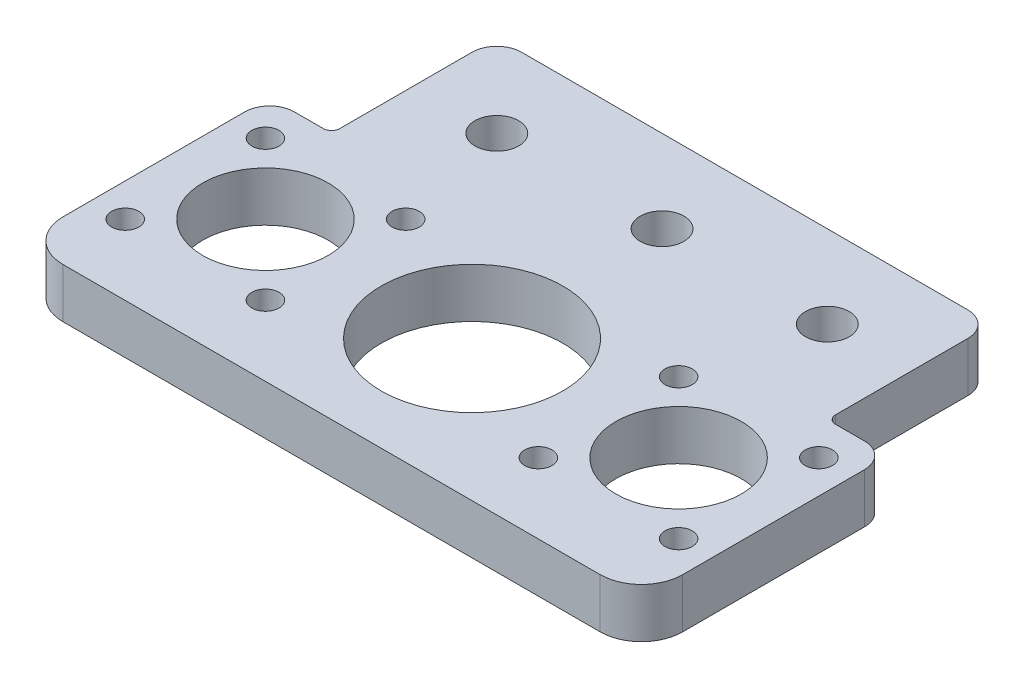
ISO-10303-21;
HEADER;
FILE_DESCRIPTION(('STEP AP214'),'2;1');
FILE_NAME('part.step','',(''),(''),'','','');
FILE_SCHEMA(('AUTOMOTIVE_DESIGN { 1 0 10303 214 1 1 1 1 }'));
ENDSEC;
DATA;
#1=APPLICATION_CONTEXT('core data for automotive mechanical design processes');
#2=APPLICATION_PROTOCOL_DEFINITION('international standard','automotive_design',2000,#1);
#3=PRODUCT_CONTEXT('',#1,'mechanical');
#4=PRODUCT('Part','Part','',(#3));
#5=PRODUCT_RELATED_PRODUCT_CATEGORY('part','',(#4));
#6=PRODUCT_DEFINITION_FORMATION('','',#4);
#7=PRODUCT_DEFINITION_CONTEXT('part definition',#1,'design');
#8=PRODUCT_DEFINITION('design','',#6,#7);
#9=PRODUCT_DEFINITION_SHAPE('','',#8);
#10=(LENGTH_UNIT() NAMED_UNIT(*) SI_UNIT(.MILLI.,.METRE.));
#11=(NAMED_UNIT(*) PLANE_ANGLE_UNIT() SI_UNIT($,.RADIAN.));
#12=(NAMED_UNIT(*) SI_UNIT($,.STERADIAN.) SOLID_ANGLE_UNIT());
#13=UNCERTAINTY_MEASURE_WITH_UNIT(LENGTH_MEASURE(1.E-05),#10,'distance_accuracy_value','');
#14=(GEOMETRIC_REPRESENTATION_CONTEXT(3) GLOBAL_UNCERTAINTY_ASSIGNED_CONTEXT((#13)) GLOBAL_UNIT_ASSIGNED_CONTEXT((#10,
#11,#12)) REPRESENTATION_CONTEXT('',''));
#15=CARTESIAN_POINT('',(0.,0.,0.));
#16=DIRECTION('',(0.,0.,1.));
#17=DIRECTION('',(1.,0.,0.));
#18=AXIS2_PLACEMENT_3D('',#15,#16,#17);
#19=CARTESIAN_POINT('',(-23.6763030341339,11.6514880135148,40.5248396396813));
#20=DIRECTION('',(0.,0.,-1.));
#21=DIRECTION('',(-1.,0.,0.));
#22=AXIS2_PLACEMENT_3D('',#19,#20,#21);
#23=PLANE('',#22);
#24=DIRECTION('',(1.,0.,0.));
#25=VECTOR('',#24,1.);
#26=CARTESIAN_POINT('',(-23.6763030341339,5.65148801351478,40.5248396396813));
#27=LINE('',#26,#25);
#28=CARTESIAN_POINT('',(-56.1763030341338,5.65148801351478,40.5248396396813));
#29=VERTEX_POINT('',#28);
#30=CARTESIAN_POINT('',(8.82369696586612,5.65148801351478,40.5248396396813));
#31=VERTEX_POINT('',#30);
#32=EDGE_CURVE('E172',#29,#31,#27,.T.);
#33=ORIENTED_EDGE('',*,*,#32,.T.);
#34=DIRECTION('',(0.,-1.,0.));
#35=VECTOR('',#34,1.);
#36=CARTESIAN_POINT('',(8.82369696586612,11.6514880135148,40.5248396396813));
#37=LINE('',#36,#35);
#38=CARTESIAN_POINT('',(8.82369696586612,11.6514880135148,40.5248396396813));
#39=VERTEX_POINT('',#38);
#40=EDGE_CURVE('E152',#39,#31,#37,.T.);
#41=ORIENTED_EDGE('',*,*,#40,.F.);
#42=DIRECTION('',(1.,0.,0.));
#43=VECTOR('',#42,1.);
#44=CARTESIAN_POINT('',(-23.6763030341339,11.6514880135148,40.5248396396813));
#45=LINE('',#44,#43);
#46=CARTESIAN_POINT('',(-56.1763030341338,11.6514880135148,40.5248396396813));
#47=VERTEX_POINT('',#46);
#48=EDGE_CURVE('E159',#47,#39,#45,.T.);
#49=ORIENTED_EDGE('',*,*,#48,.F.);
#50=DIRECTION('',(0.,-1.,0.));
#51=VECTOR('',#50,1.);
#52=CARTESIAN_POINT('',(-56.1763030341338,11.6514880135148,40.5248396396813));
#53=LINE('',#52,#51);
#54=EDGE_CURVE('E267',#47,#29,#53,.T.);
#55=ORIENTED_EDGE('',*,*,#54,.T.);
#56=EDGE_LOOP('',(#33,#41,#49,#55));
#57=FACE_BOUND('',#56,.T.);
#58=ADVANCED_FACE('F35',(#57),#23,.F.);
#59=CARTESIAN_POINT('',(8.82369696586615,11.6514880135148,35.5248396396813));
#60=DIRECTION('',(0.,-1.,0.));
#61=DIRECTION('',(0.,0.,-1.));
#62=AXIS2_PLACEMENT_3D('',#59,#60,#61);
#63=CYLINDRICAL_SURFACE('',#62,5.);
#64=CARTESIAN_POINT('',(8.82369696586615,5.65148801351478,35.5248396396813));
#65=DIRECTION('',(0.,1.,0.));
#66=DIRECTION('',(0.,0.,1.));
#67=AXIS2_PLACEMENT_3D('',#64,#65,#66);
#68=CIRCLE('',#67,5.);
#69=CARTESIAN_POINT('',(13.8236969658661,5.65148801351478,35.5248396396812));
#70=VERTEX_POINT('',#69);
#71=EDGE_CURVE('E276',#31,#70,#68,.T.);
#72=ORIENTED_EDGE('',*,*,#71,.T.);
#73=DIRECTION('',(0.,-1.,0.));
#74=VECTOR('',#73,1.);
#75=CARTESIAN_POINT('',(13.8236969658661,11.6514880135148,35.5248396396812));
#76=LINE('',#75,#74);
#77=CARTESIAN_POINT('',(13.8236969658661,11.6514880135148,35.5248396396812));
#78=VERTEX_POINT('',#77);
#79=EDGE_CURVE('E155',#78,#70,#76,.T.);
#80=ORIENTED_EDGE('',*,*,#79,.F.);
#81=CARTESIAN_POINT('',(8.82369696586615,11.6514880135148,35.5248396396813));
#82=DIRECTION('',(0.,1.,0.));
#83=DIRECTION('',(0.,0.,1.));
#84=AXIS2_PLACEMENT_3D('',#81,#82,#83);
#85=CIRCLE('',#84,5.);
#86=EDGE_CURVE('E147',#39,#78,#85,.T.);
#87=ORIENTED_EDGE('',*,*,#86,.F.);
#88=ORIENTED_EDGE('',*,*,#40,.T.);
#89=EDGE_LOOP('',(#72,#80,#87,#88));
#90=FACE_BOUND('',#89,.T.);
#91=ADVANCED_FACE('F150',(#90),#63,.T.);
#92=CARTESIAN_POINT('',(13.8236969658661,11.6514880135148,23.5248396396813));
#93=DIRECTION('',(1.,0.,0.));
#94=DIRECTION('',(0.,0.,-1.));
#95=AXIS2_PLACEMENT_3D('',#92,#93,#94);
#96=PLANE('',#95);
#97=DIRECTION('',(0.,0.,1.));
#98=VECTOR('',#97,1.);
#99=CARTESIAN_POINT('',(13.8236969658661,5.65148801351478,23.5248396396813));
#100=LINE('',#99,#98);
#101=CARTESIAN_POINT('',(13.8236969658661,5.65148801351478,13.5248396396813));
#102=VERTEX_POINT('',#101);
#103=EDGE_CURVE('E279',#102,#70,#100,.T.);
#104=ORIENTED_EDGE('',*,*,#103,.F.);
#105=DIRECTION('',(0.,-1.,0.));
#106=VECTOR('',#105,1.);
#107=CARTESIAN_POINT('',(13.8236969658661,11.6514880135148,13.5248396396813));
#108=LINE('',#107,#106);
#109=CARTESIAN_POINT('',(13.8236969658661,11.6514880135148,13.5248396396813));
#110=VERTEX_POINT('',#109);
#111=EDGE_CURVE('E215',#102,#110,#108,.F.);
#112=ORIENTED_EDGE('',*,*,#111,.T.);
#113=DIRECTION('',(0.,0.,1.));
#114=VECTOR('',#113,1.);
#115=CARTESIAN_POINT('',(13.8236969658661,11.6514880135148,23.5248396396813));
#116=LINE('',#115,#114);
#117=EDGE_CURVE('E158',#110,#78,#116,.T.);
#118=ORIENTED_EDGE('',*,*,#117,.T.);
#119=ORIENTED_EDGE('',*,*,#79,.T.);
#120=EDGE_LOOP('',(#104,#112,#118,#119));
#121=FACE_BOUND('',#120,.T.);
#122=ADVANCED_FACE('F375',(#121),#96,.T.);
#123=CARTESIAN_POINT('',(-23.6763030341339,11.6514880135148,10.5248396396813));
#124=DIRECTION('',(0.,0.,-1.));
#125=DIRECTION('',(-1.,0.,0.));
#126=AXIS2_PLACEMENT_3D('',#123,#124,#125);
#127=PLANE('',#126);
#128=DIRECTION('',(1.,0.,0.));
#129=VECTOR('',#128,1.);
#130=CARTESIAN_POINT('',(-23.6763030341339,5.65148801351478,10.5248396396813));
#131=LINE('',#130,#129);
#132=CARTESIAN_POINT('',(7.32369696586613,5.65148801351478,10.5248396396813));
#133=VERTEX_POINT('',#132);
#134=CARTESIAN_POINT('',(10.8236969658661,5.65148801351478,10.5248396396813));
#135=VERTEX_POINT('',#134);
#136=EDGE_CURVE('E287',#133,#135,#131,.T.);
#137=ORIENTED_EDGE('',*,*,#136,.F.);
#138=DIRECTION('',(0.,-1.,0.));
#139=VECTOR('',#138,1.);
#140=CARTESIAN_POINT('',(7.32369696586613,11.6514880135148,10.5248396396813));
#141=LINE('',#140,#139);
#142=CARTESIAN_POINT('',(7.32369696586613,11.6514880135148,10.5248396396813));
#143=VERTEX_POINT('',#142);
#144=EDGE_CURVE('E56',#133,#143,#141,.F.);
#145=ORIENTED_EDGE('',*,*,#144,.T.);
#146=DIRECTION('',(1.,0.,0.));
#147=VECTOR('',#146,1.);
#148=CARTESIAN_POINT('',(-23.6763030341339,11.6514880135148,10.5248396396813));
#149=LINE('',#148,#147);
#150=CARTESIAN_POINT('',(10.8236969658661,11.6514880135148,10.5248396396813));
#151=VERTEX_POINT('',#150);
#152=EDGE_CURVE('E309',#143,#151,#149,.T.);
#153=ORIENTED_EDGE('',*,*,#152,.T.);
#154=DIRECTION('',(0.,-1.,0.));
#155=VECTOR('',#154,1.);
#156=CARTESIAN_POINT('',(10.8236969658661,11.6514880135148,10.5248396396813));
#157=LINE('',#156,#155);
#158=EDGE_CURVE('E212',#151,#135,#157,.T.);
#159=ORIENTED_EDGE('',*,*,#158,.T.);
#160=EDGE_LOOP('',(#137,#145,#153,#159));
#161=FACE_BOUND('',#160,.T.);
#162=ADVANCED_FACE('F380',(#161),#127,.T.);
#163=CARTESIAN_POINT('',(6.32369696586613,11.6514880135148,23.5248396396813));
#164=DIRECTION('',(1.,0.,0.));
#165=DIRECTION('',(0.,0.,-1.));
#166=AXIS2_PLACEMENT_3D('',#163,#164,#165);
#167=PLANE('',#166);
#168=DIRECTION('',(0.,0.,1.));
#169=VECTOR('',#168,1.);
#170=CARTESIAN_POINT('',(6.32369696586613,11.6514880135148,23.5248396396813));
#171=LINE('',#170,#169);
#172=CARTESIAN_POINT('',(6.32369696586613,11.6514880135148,-6.47516036031873));
#173=VERTEX_POINT('',#172);
#174=CARTESIAN_POINT('',(6.32369696586613,11.6514880135148,9.52483963968127));
#175=VERTEX_POINT('',#174);
#176=EDGE_CURVE('E302',#173,#175,#171,.T.);
#177=ORIENTED_EDGE('',*,*,#176,.T.);
#178=DIRECTION('',(0.,-1.,0.));
#179=VECTOR('',#178,1.);
#180=CARTESIAN_POINT('',(6.32369696586613,5.65148801351478,9.52483963968127));
#181=LINE('',#180,#179);
#182=CARTESIAN_POINT('',(6.32369696586613,5.65148801351478,9.52483963968127));
#183=VERTEX_POINT('',#182);
#184=EDGE_CURVE('E222',#175,#183,#181,.T.);
#185=ORIENTED_EDGE('',*,*,#184,.T.);
#186=DIRECTION('',(0.,0.,1.));
#187=VECTOR('',#186,1.);
#188=CARTESIAN_POINT('',(6.32369696586613,5.65148801351478,23.5248396396813));
#189=LINE('',#188,#187);
#190=CARTESIAN_POINT('',(6.32369696586613,5.65148801351478,-6.47516036031873));
#191=VERTEX_POINT('',#190);
#192=EDGE_CURVE('E259',#191,#183,#189,.T.);
#193=ORIENTED_EDGE('',*,*,#192,.F.);
#194=DIRECTION('',(0.,-1.,0.));
#195=VECTOR('',#194,1.);
#196=CARTESIAN_POINT('',(6.32369696586613,11.6514880135148,-6.47516036031873));
#197=LINE('',#196,#195);
#198=EDGE_CURVE('E192',#191,#173,#197,.F.);
#199=ORIENTED_EDGE('',*,*,#198,.T.);
#200=EDGE_LOOP('',(#177,#185,#193,#199));
#201=FACE_BOUND('',#200,.T.);
#202=ADVANCED_FACE('F292',(#201),#167,.T.);
#203=CARTESIAN_POINT('',(-23.6763030341339,11.6514880135148,-9.47516036031873));
#204=DIRECTION('',(0.,0.,-1.));
#205=DIRECTION('',(-1.,0.,0.));
#206=AXIS2_PLACEMENT_3D('',#203,#204,#205);
#207=PLANE('',#206);
#208=DIRECTION('',(1.,0.,0.));
#209=VECTOR('',#208,1.);
#210=CARTESIAN_POINT('',(-23.6763030341339,11.6514880135148,-9.47516036031873));
#211=LINE('',#210,#209);
#212=CARTESIAN_POINT('',(-50.6763030341339,11.6514880135148,-9.47516036031873));
#213=VERTEX_POINT('',#212);
#214=CARTESIAN_POINT('',(3.32369696586613,11.6514880135148,-9.47516036031873));
#215=VERTEX_POINT('',#214);
#216=EDGE_CURVE('E300',#213,#215,#211,.T.);
#217=ORIENTED_EDGE('',*,*,#216,.T.);
#218=DIRECTION('',(0.,-1.,0.));
#219=VECTOR('',#218,1.);
#220=CARTESIAN_POINT('',(3.32369696586613,11.6514880135148,-9.47516036031873));
#221=LINE('',#220,#219);
#222=CARTESIAN_POINT('',(3.32369696586613,5.65148801351478,-9.47516036031873));
#223=VERTEX_POINT('',#222);
#224=EDGE_CURVE('E175',#215,#223,#221,.T.);
#225=ORIENTED_EDGE('',*,*,#224,.T.);
#226=DIRECTION('',(1.,0.,0.));
#227=VECTOR('',#226,1.);
#228=CARTESIAN_POINT('',(-23.6763030341339,5.65148801351478,-9.47516036031873));
#229=LINE('',#228,#227);
#230=CARTESIAN_POINT('',(-50.6763030341339,5.65148801351478,-9.47516036031873));
#231=VERTEX_POINT('',#230);
#232=EDGE_CURVE('E255',#231,#223,#229,.T.);
#233=ORIENTED_EDGE('',*,*,#232,.F.);
#234=DIRECTION('',(0.,-1.,0.));
#235=VECTOR('',#234,1.);
#236=CARTESIAN_POINT('',(-50.6763030341339,11.6514880135148,-9.47516036031873));
#237=LINE('',#236,#235);
#238=EDGE_CURVE('E173',#231,#213,#237,.F.);
#239=ORIENTED_EDGE('',*,*,#238,.T.);
#240=EDGE_LOOP('',(#217,#225,#233,#239));
#241=FACE_BOUND('',#240,.T.);
#242=ADVANCED_FACE('F304',(#241),#207,.T.);
#243=CARTESIAN_POINT('',(-53.6763030341339,11.6514880135148,23.5248396396813));
#244=DIRECTION('',(1.,0.,0.));
#245=DIRECTION('',(0.,0.,-1.));
#246=AXIS2_PLACEMENT_3D('',#243,#244,#245);
#247=PLANE('',#246);
#248=DIRECTION('',(0.,0.,1.));
#249=VECTOR('',#248,1.);
#250=CARTESIAN_POINT('',(-53.6763030341339,5.65148801351478,23.5248396396813));
#251=LINE('',#250,#249);
#252=CARTESIAN_POINT('',(-53.6763030341339,5.65148801351478,-6.47516036031873));
#253=VERTEX_POINT('',#252);
#254=CARTESIAN_POINT('',(-53.6763030341339,5.65148801351478,9.52483963968127));
#255=VERTEX_POINT('',#254);
#256=EDGE_CURVE('E250',#253,#255,#251,.T.);
#257=ORIENTED_EDGE('',*,*,#256,.T.);
#258=DIRECTION('',(0.,-1.,0.));
#259=VECTOR('',#258,1.);
#260=CARTESIAN_POINT('',(-53.6763030341339,11.6514880135148,9.52483963968127));
#261=LINE('',#260,#259);
#262=CARTESIAN_POINT('',(-53.6763030341339,11.6514880135148,9.52483963968127));
#263=VERTEX_POINT('',#262);
#264=EDGE_CURVE('E220',#255,#263,#261,.F.);
#265=ORIENTED_EDGE('',*,*,#264,.T.);
#266=DIRECTION('',(0.,0.,1.));
#267=VECTOR('',#266,1.);
#268=CARTESIAN_POINT('',(-53.6763030341339,11.6514880135148,23.5248396396813));
#269=LINE('',#268,#267);
#270=CARTESIAN_POINT('',(-53.6763030341339,11.6514880135148,-6.47516036031873));
#271=VERTEX_POINT('',#270);
#272=EDGE_CURVE('E234',#271,#263,#269,.T.);
#273=ORIENTED_EDGE('',*,*,#272,.F.);
#274=DIRECTION('',(0.,-1.,0.));
#275=VECTOR('',#274,1.);
#276=CARTESIAN_POINT('',(-53.6763030341339,5.65148801351478,-6.47516036031873));
#277=LINE('',#276,#275);
#278=EDGE_CURVE('E203',#271,#253,#277,.T.);
#279=ORIENTED_EDGE('',*,*,#278,.T.);
#280=EDGE_LOOP('',(#257,#265,#273,#279));
#281=FACE_BOUND('',#280,.T.);
#282=ADVANCED_FACE('F253',(#281),#247,.F.);
#283=CARTESIAN_POINT('',(-23.6763030341339,11.6514880135148,10.5248396396813));
#284=DIRECTION('',(0.,0.,1.));
#285=DIRECTION('',(1.,0.,0.));
#286=AXIS2_PLACEMENT_3D('',#283,#284,#285);
#287=PLANE('',#286);
#288=DIRECTION('',(-1.,0.,0.));
#289=VECTOR('',#288,1.);
#290=CARTESIAN_POINT('',(-23.6763030341339,11.6514880135148,10.5248396396813));
#291=LINE('',#290,#289);
#292=CARTESIAN_POINT('',(-54.6763030341339,11.6514880135148,10.5248396396813));
#293=VERTEX_POINT('',#292);
#294=CARTESIAN_POINT('',(-58.1763030341339,11.6514880135148,10.5248396396813));
#295=VERTEX_POINT('',#294);
#296=EDGE_CURVE('E232',#293,#295,#291,.T.);
#297=ORIENTED_EDGE('',*,*,#296,.F.);
#298=DIRECTION('',(0.,-1.,0.));
#299=VECTOR('',#298,1.);
#300=CARTESIAN_POINT('',(-54.6763030341339,5.65148801351478,10.5248396396813));
#301=LINE('',#300,#299);
#302=CARTESIAN_POINT('',(-54.6763030341339,5.65148801351478,10.5248396396813));
#303=VERTEX_POINT('',#302);
#304=EDGE_CURVE('E217',#293,#303,#301,.T.);
#305=ORIENTED_EDGE('',*,*,#304,.T.);
#306=DIRECTION('',(-1.,0.,0.));
#307=VECTOR('',#306,1.);
#308=CARTESIAN_POINT('',(-23.6763030341339,5.65148801351478,10.5248396396813));
#309=LINE('',#308,#307);
#310=CARTESIAN_POINT('',(-58.1763030341339,5.65148801351478,10.5248396396813));
#311=VERTEX_POINT('',#310);
#312=EDGE_CURVE('E251',#303,#311,#309,.T.);
#313=ORIENTED_EDGE('',*,*,#312,.T.);
#314=DIRECTION('',(0.,-1.,0.));
#315=VECTOR('',#314,1.);
#316=CARTESIAN_POINT('',(-58.1763030341339,11.6514880135148,10.5248396396813));
#317=LINE('',#316,#315);
#318=EDGE_CURVE('E209',#311,#295,#317,.F.);
#319=ORIENTED_EDGE('',*,*,#318,.T.);
#320=EDGE_LOOP('',(#297,#305,#313,#319));
#321=FACE_BOUND('',#320,.T.);
#322=ADVANCED_FACE('F239',(#321),#287,.F.);
#323=CARTESIAN_POINT('',(-61.1763030341339,11.6514880135148,23.5248396396813));
#324=DIRECTION('',(1.,0.,0.));
#325=DIRECTION('',(0.,0.,-1.));
#326=AXIS2_PLACEMENT_3D('',#323,#324,#325);
#327=PLANE('',#326);
#328=DIRECTION('',(0.,0.,1.));
#329=VECTOR('',#328,1.);
#330=CARTESIAN_POINT('',(-61.1763030341339,11.6514880135148,23.5248396396813));
#331=LINE('',#330,#329);
#332=CARTESIAN_POINT('',(-61.1763030341339,11.6514880135148,13.5248396396813));
#333=VERTEX_POINT('',#332);
#334=CARTESIAN_POINT('',(-61.1763030341339,11.6514880135148,35.5248396396812));
#335=VERTEX_POINT('',#334);
#336=EDGE_CURVE('E243',#333,#335,#331,.T.);
#337=ORIENTED_EDGE('',*,*,#336,.F.);
#338=DIRECTION('',(0.,-1.,0.));
#339=VECTOR('',#338,1.);
#340=CARTESIAN_POINT('',(-61.1763030341339,11.6514880135148,13.5248396396813));
#341=LINE('',#340,#339);
#342=CARTESIAN_POINT('',(-61.1763030341339,5.65148801351478,13.5248396396813));
#343=VERTEX_POINT('',#342);
#344=EDGE_CURVE('E206',#333,#343,#341,.T.);
#345=ORIENTED_EDGE('',*,*,#344,.T.);
#346=DIRECTION('',(0.,0.,1.));
#347=VECTOR('',#346,1.);
#348=CARTESIAN_POINT('',(-61.1763030341339,5.65148801351478,23.5248396396813));
#349=LINE('',#348,#347);
#350=CARTESIAN_POINT('',(-61.1763030341339,5.65148801351478,35.5248396396812));
#351=VERTEX_POINT('',#350);
#352=EDGE_CURVE('E257',#343,#351,#349,.T.);
#353=ORIENTED_EDGE('',*,*,#352,.T.);
#354=DIRECTION('',(0.,-1.,0.));
#355=VECTOR('',#354,1.);
#356=CARTESIAN_POINT('',(-61.1763030341339,11.6514880135148,35.5248396396812));
#357=LINE('',#356,#355);
#358=EDGE_CURVE('E177',#335,#351,#357,.T.);
#359=ORIENTED_EDGE('',*,*,#358,.F.);
#360=EDGE_LOOP('',(#337,#345,#353,#359));
#361=FACE_BOUND('',#360,.T.);
#362=ADVANCED_FACE('F366',(#361),#327,.F.);
#363=CARTESIAN_POINT('',(-3.67630303413388,11.6514880135148,0.524839639681272));
#364=DIRECTION('',(0.,-1.,0.));
#365=DIRECTION('',(0.,0.,-1.));
#366=AXIS2_PLACEMENT_3D('',#363,#364,#365);
#367=CYLINDRICAL_SURFACE('',#366,2.65);
#368=CARTESIAN_POINT('',(-3.67630303413388,11.6514880135148,0.524839639681272));
#369=DIRECTION('',(0.,1.,0.));
#370=DIRECTION('',(0.,0.,1.));
#371=AXIS2_PLACEMENT_3D('',#368,#369,#370);
#372=CIRCLE('',#371,2.65);
#373=CARTESIAN_POINT('',(-3.67630303413388,11.6514880135148,3.17483963968127));
#374=VERTEX_POINT('',#373);
#375=EDGE_CURVE('E169',#374,#374,#372,.T.);
#376=ORIENTED_EDGE('',*,*,#375,.T.);
#377=EDGE_LOOP('',(#376));
#378=FACE_BOUND('',#377,.T.);
#379=CARTESIAN_POINT('',(-3.67630303413388,5.65148801351478,0.524839639681272));
#380=DIRECTION('',(0.,1.,0.));
#381=DIRECTION('',(0.,0.,1.));
#382=AXIS2_PLACEMENT_3D('',#379,#380,#381);
#383=CIRCLE('',#382,2.65);
#384=CARTESIAN_POINT('',(-3.67630303413388,5.65148801351478,3.17483963968127));
#385=VERTEX_POINT('',#384);
#386=EDGE_CURVE('E277',#385,#385,#383,.T.);
#387=ORIENTED_EDGE('',*,*,#386,.F.);
#388=EDGE_LOOP('',(#387));
#389=FACE_BOUND('',#388,.T.);
#390=ADVANCED_FACE('F356',(#378,#389),#367,.F.);
#391=CARTESIAN_POINT('',(-23.6763030341339,11.6514880135148,0.524839639681272));
#392=DIRECTION('',(0.,-1.,0.));
#393=DIRECTION('',(0.,0.,-1.));
#394=AXIS2_PLACEMENT_3D('',#391,#392,#393);
#395=CYLINDRICAL_SURFACE('',#394,2.65);
#396=CARTESIAN_POINT('',(-23.6763030341339,11.6514880135148,0.524839639681272));
#397=DIRECTION('',(0.,1.,0.));
#398=DIRECTION('',(0.,0.,1.));
#399=AXIS2_PLACEMENT_3D('',#396,#397,#398);
#400=CIRCLE('',#399,2.65);
#401=CARTESIAN_POINT('',(-23.6763030341339,11.6514880135148,3.17483963968127));
#402=VERTEX_POINT('',#401);
#403=EDGE_CURVE('E451',#402,#402,#400,.T.);
#404=ORIENTED_EDGE('',*,*,#403,.T.);
#405=EDGE_LOOP('',(#404));
#406=FACE_BOUND('',#405,.T.);
#407=CARTESIAN_POINT('',(-23.6763030341339,5.65148801351478,0.524839639681272));
#408=DIRECTION('',(0.,1.,0.));
#409=DIRECTION('',(0.,0.,1.));
#410=AXIS2_PLACEMENT_3D('',#407,#408,#409);
#411=CIRCLE('',#410,2.65);
#412=CARTESIAN_POINT('',(-23.6763030341339,5.65148801351478,3.17483963968127));
#413=VERTEX_POINT('',#412);
#414=EDGE_CURVE('E282',#413,#413,#411,.T.);
#415=ORIENTED_EDGE('',*,*,#414,.F.);
#416=EDGE_LOOP('',(#415));
#417=FACE_BOUND('',#416,.T.);
#418=ADVANCED_FACE('F353',(#406,#417),#395,.F.);
#419=CARTESIAN_POINT('',(-43.6763030341339,11.6514880135148,0.524839639681272));
#420=DIRECTION('',(0.,-1.,0.));
#421=DIRECTION('',(0.,0.,-1.));
#422=AXIS2_PLACEMENT_3D('',#419,#420,#421);
#423=CYLINDRICAL_SURFACE('',#422,2.65);
#424=CARTESIAN_POINT('',(-43.6763030341339,11.6514880135148,0.524839639681272));
#425=DIRECTION('',(0.,1.,0.));
#426=DIRECTION('',(0.,0.,1.));
#427=AXIS2_PLACEMENT_3D('',#424,#425,#426);
#428=CIRCLE('',#427,2.65);
#429=CARTESIAN_POINT('',(-43.6763030341339,11.6514880135148,3.17483963968127));
#430=VERTEX_POINT('',#429);
#431=EDGE_CURVE('E448',#430,#430,#428,.T.);
#432=ORIENTED_EDGE('',*,*,#431,.T.);
#433=EDGE_LOOP('',(#432));
#434=FACE_BOUND('',#433,.T.);
#435=CARTESIAN_POINT('',(-43.6763030341339,5.65148801351478,0.524839639681272));
#436=DIRECTION('',(0.,1.,0.));
#437=DIRECTION('',(0.,0.,1.));
#438=AXIS2_PLACEMENT_3D('',#435,#436,#437);
#439=CIRCLE('',#438,2.65);
#440=CARTESIAN_POINT('',(-43.6763030341339,5.65148801351478,3.17483963968127));
#441=VERTEX_POINT('',#440);
#442=EDGE_CURVE('E346',#441,#441,#439,.T.);
#443=ORIENTED_EDGE('',*,*,#442,.F.);
#444=EDGE_LOOP('',(#443));
#445=FACE_BOUND('',#444,.T.);
#446=ADVANCED_FACE('F355',(#434,#445),#423,.F.);
#447=CARTESIAN_POINT('',(1.32369696586613,11.6514880135148,23.5248396396813));
#448=DIRECTION('',(0.,-1.,0.));
#449=DIRECTION('',(0.,0.,-1.));
#450=AXIS2_PLACEMENT_3D('',#447,#448,#449);
#451=CYLINDRICAL_SURFACE('',#450,7.6);
#452=CARTESIAN_POINT('',(1.32369696586613,11.6514880135148,23.5248396396813));
#453=DIRECTION('',(0.,1.,0.));
#454=DIRECTION('',(0.,0.,1.));
#455=AXIS2_PLACEMENT_3D('',#452,#453,#454);
#456=CIRCLE('',#455,7.6);
#457=CARTESIAN_POINT('',(1.32369696586613,11.6514880135148,31.1248396396813));
#458=VERTEX_POINT('',#457);
#459=EDGE_CURVE('E445',#458,#458,#456,.F.);
#460=ORIENTED_EDGE('',*,*,#459,.F.);
#461=EDGE_LOOP('',(#460));
#462=FACE_BOUND('',#461,.T.);
#463=CARTESIAN_POINT('',(1.32369696586613,5.65148801351478,23.5248396396813));
#464=DIRECTION('',(0.,1.,0.));
#465=DIRECTION('',(0.,0.,1.));
#466=AXIS2_PLACEMENT_3D('',#463,#464,#465);
#467=CIRCLE('',#466,7.6);
#468=CARTESIAN_POINT('',(1.32369696586613,5.65148801351478,31.1248396396813));
#469=VERTEX_POINT('',#468);
#470=EDGE_CURVE('E343',#469,#469,#467,.F.);
#471=ORIENTED_EDGE('',*,*,#470,.T.);
#472=EDGE_LOOP('',(#471));
#473=FACE_BOUND('',#472,.T.);
#474=ADVANCED_FACE('F363',(#462,#473),#451,.F.);
#475=CARTESIAN_POINT('',(-7.16158440837245,11.6514880135148,15.0395582654427));
#476=DIRECTION('',(0.,-1.,0.));
#477=DIRECTION('',(0.,0.,-1.));
#478=AXIS2_PLACEMENT_3D('',#475,#476,#477);
#479=CYLINDRICAL_SURFACE('',#478,1.65);
#480=CARTESIAN_POINT('',(-7.16158440837245,11.6514880135148,15.0395582654427));
#481=DIRECTION('',(0.,1.,0.));
#482=DIRECTION('',(0.,0.,1.));
#483=AXIS2_PLACEMENT_3D('',#480,#481,#482);
#484=CIRCLE('',#483,1.65);
#485=CARTESIAN_POINT('',(-7.16158440837245,11.6514880135148,16.6895582654427));
#486=VERTEX_POINT('',#485);
#487=EDGE_CURVE('E442',#486,#486,#484,.F.);
#488=ORIENTED_EDGE('',*,*,#487,.F.);
#489=EDGE_LOOP('',(#488));
#490=FACE_BOUND('',#489,.T.);
#491=CARTESIAN_POINT('',(-7.16158440837245,5.65148801351478,15.0395582654427));
#492=DIRECTION('',(0.,1.,0.));
#493=DIRECTION('',(0.,0.,1.));
#494=AXIS2_PLACEMENT_3D('',#491,#492,#493);
#495=CIRCLE('',#494,1.65);
#496=CARTESIAN_POINT('',(-7.16158440837245,5.65148801351478,16.6895582654427));
#497=VERTEX_POINT('',#496);
#498=EDGE_CURVE('E340',#497,#497,#495,.F.);
#499=ORIENTED_EDGE('',*,*,#498,.T.);
#500=EDGE_LOOP('',(#499));
#501=FACE_BOUND('',#500,.T.);
#502=ADVANCED_FACE('F509',(#490,#501),#479,.F.);
#503=CARTESIAN_POINT('',(-48.6763030341339,11.6514880135148,23.5248396396813));
#504=DIRECTION('',(0.,-1.,0.));
#505=DIRECTION('',(0.,0.,-1.));
#506=AXIS2_PLACEMENT_3D('',#503,#504,#505);
#507=CYLINDRICAL_SURFACE('',#506,7.6);
#508=CARTESIAN_POINT('',(-48.6763030341339,11.6514880135148,23.5248396396813));
#509=DIRECTION('',(0.,1.,0.));
#510=DIRECTION('',(0.,0.,1.));
#511=AXIS2_PLACEMENT_3D('',#508,#509,#510);
#512=CIRCLE('',#511,7.6);
#513=CARTESIAN_POINT('',(-48.6763030341339,11.6514880135148,31.1248396396813));
#514=VERTEX_POINT('',#513);
#515=EDGE_CURVE('E439',#514,#514,#512,.T.);
#516=ORIENTED_EDGE('',*,*,#515,.T.);
#517=EDGE_LOOP('',(#516));
#518=FACE_BOUND('',#517,.T.);
#519=CARTESIAN_POINT('',(-48.6763030341339,5.65148801351478,23.5248396396813));
#520=DIRECTION('',(0.,1.,0.));
#521=DIRECTION('',(0.,0.,1.));
#522=AXIS2_PLACEMENT_3D('',#519,#520,#521);
#523=CIRCLE('',#522,7.6);
#524=CARTESIAN_POINT('',(-48.6763030341339,5.65148801351478,31.1248396396813));
#525=VERTEX_POINT('',#524);
#526=EDGE_CURVE('E337',#525,#525,#523,.T.);
#527=ORIENTED_EDGE('',*,*,#526,.F.);
#528=EDGE_LOOP('',(#527));
#529=FACE_BOUND('',#528,.T.);
#530=ADVANCED_FACE('F505',(#518,#529),#507,.F.);
#531=CARTESIAN_POINT('',(-57.1615844083724,11.6514880135148,15.0395582654427));
#532=DIRECTION('',(0.,-1.,0.));
#533=DIRECTION('',(0.,0.,-1.));
#534=AXIS2_PLACEMENT_3D('',#531,#532,#533);
#535=CYLINDRICAL_SURFACE('',#534,1.65);
#536=CARTESIAN_POINT('',(-57.1615844083724,11.6514880135148,15.0395582654427));
#537=DIRECTION('',(0.,1.,0.));
#538=DIRECTION('',(0.,0.,1.));
#539=AXIS2_PLACEMENT_3D('',#536,#537,#538);
#540=CIRCLE('',#539,1.65);
#541=CARTESIAN_POINT('',(-57.1615844083724,11.6514880135148,16.6895582654427));
#542=VERTEX_POINT('',#541);
#543=EDGE_CURVE('E436',#542,#542,#540,.T.);
#544=ORIENTED_EDGE('',*,*,#543,.T.);
#545=EDGE_LOOP('',(#544));
#546=FACE_BOUND('',#545,.T.);
#547=CARTESIAN_POINT('',(-57.1615844083724,5.65148801351478,15.0395582654427));
#548=DIRECTION('',(0.,1.,0.));
#549=DIRECTION('',(0.,0.,1.));
#550=AXIS2_PLACEMENT_3D('',#547,#548,#549);
#551=CIRCLE('',#550,1.65);
#552=CARTESIAN_POINT('',(-57.1615844083724,5.65148801351478,16.6895582654427));
#553=VERTEX_POINT('',#552);
#554=EDGE_CURVE('E334',#553,#553,#551,.T.);
#555=ORIENTED_EDGE('',*,*,#554,.F.);
#556=EDGE_LOOP('',(#555));
#557=FACE_BOUND('',#556,.T.);
#558=ADVANCED_FACE('F501',(#546,#557),#535,.F.);
#559=CARTESIAN_POINT('',(-40.1910216598953,11.6514880135148,15.0395582654427));
#560=DIRECTION('',(0.,-1.,0.));
#561=DIRECTION('',(0.,0.,-1.));
#562=AXIS2_PLACEMENT_3D('',#559,#560,#561);
#563=CYLINDRICAL_SURFACE('',#562,1.65);
#564=CARTESIAN_POINT('',(-40.1910216598953,11.6514880135148,15.0395582654427));
#565=DIRECTION('',(0.,1.,0.));
#566=DIRECTION('',(0.,0.,1.));
#567=AXIS2_PLACEMENT_3D('',#564,#565,#566);
#568=CIRCLE('',#567,1.65);
#569=CARTESIAN_POINT('',(-40.1910216598953,11.6514880135148,16.6895582654427));
#570=VERTEX_POINT('',#569);
#571=EDGE_CURVE('E433',#570,#570,#568,.T.);
#572=ORIENTED_EDGE('',*,*,#571,.T.);
#573=EDGE_LOOP('',(#572));
#574=FACE_BOUND('',#573,.T.);
#575=CARTESIAN_POINT('',(-40.1910216598953,5.65148801351478,15.0395582654427));
#576=DIRECTION('',(0.,1.,0.));
#577=DIRECTION('',(0.,0.,1.));
#578=AXIS2_PLACEMENT_3D('',#575,#576,#577);
#579=CIRCLE('',#578,1.65);
#580=CARTESIAN_POINT('',(-40.1910216598953,5.65148801351478,16.6895582654427));
#581=VERTEX_POINT('',#580);
#582=EDGE_CURVE('E331',#581,#581,#579,.T.);
#583=ORIENTED_EDGE('',*,*,#582,.F.);
#584=EDGE_LOOP('',(#583));
#585=FACE_BOUND('',#584,.T.);
#586=ADVANCED_FACE('F497',(#574,#585),#563,.F.);
#587=CARTESIAN_POINT('',(-40.1910216598953,11.6514880135148,32.0101210139198));
#588=DIRECTION('',(0.,-1.,0.));
#589=DIRECTION('',(0.,0.,-1.));
#590=AXIS2_PLACEMENT_3D('',#587,#588,#589);
#591=CYLINDRICAL_SURFACE('',#590,1.65000000000001);
#592=CARTESIAN_POINT('',(-40.1910216598953,11.6514880135148,32.0101210139198));
#593=DIRECTION('',(0.,1.,0.));
#594=DIRECTION('',(0.,0.,1.));
#595=AXIS2_PLACEMENT_3D('',#592,#593,#594);
#596=CIRCLE('',#595,1.65000000000001);
#597=CARTESIAN_POINT('',(-40.1910216598953,11.6514880135148,33.6601210139198));
#598=VERTEX_POINT('',#597);
#599=EDGE_CURVE('E430',#598,#598,#596,.T.);
#600=ORIENTED_EDGE('',*,*,#599,.T.);
#601=EDGE_LOOP('',(#600));
#602=FACE_BOUND('',#601,.T.);
#603=CARTESIAN_POINT('',(-40.1910216598953,5.65148801351478,32.0101210139198));
#604=DIRECTION('',(0.,1.,0.));
#605=DIRECTION('',(0.,0.,1.));
#606=AXIS2_PLACEMENT_3D('',#603,#604,#605);
#607=CIRCLE('',#606,1.65000000000001);
#608=CARTESIAN_POINT('',(-40.1910216598953,5.65148801351478,33.6601210139198));
#609=VERTEX_POINT('',#608);
#610=EDGE_CURVE('E328',#609,#609,#607,.T.);
#611=ORIENTED_EDGE('',*,*,#610,.F.);
#612=EDGE_LOOP('',(#611));
#613=FACE_BOUND('',#612,.T.);
#614=ADVANCED_FACE('F493',(#602,#613),#591,.F.);
#615=CARTESIAN_POINT('',(-57.1615844083724,11.6514880135148,32.0101210139198));
#616=DIRECTION('',(0.,-1.,0.));
#617=DIRECTION('',(0.,0.,-1.));
#618=AXIS2_PLACEMENT_3D('',#615,#616,#617);
#619=CYLINDRICAL_SURFACE('',#618,1.65);
#620=CARTESIAN_POINT('',(-57.1615844083724,11.6514880135148,32.0101210139198));
#621=DIRECTION('',(0.,1.,0.));
#622=DIRECTION('',(0.,0.,1.));
#623=AXIS2_PLACEMENT_3D('',#620,#621,#622);
#624=CIRCLE('',#623,1.65);
#625=CARTESIAN_POINT('',(-57.1615844083724,11.6514880135148,33.6601210139198));
#626=VERTEX_POINT('',#625);
#627=EDGE_CURVE('E427',#626,#626,#624,.T.);
#628=ORIENTED_EDGE('',*,*,#627,.T.);
#629=EDGE_LOOP('',(#628));
#630=FACE_BOUND('',#629,.T.);
#631=CARTESIAN_POINT('',(-57.1615844083724,5.65148801351478,32.0101210139198));
#632=DIRECTION('',(0.,1.,0.));
#633=DIRECTION('',(0.,0.,1.));
#634=AXIS2_PLACEMENT_3D('',#631,#632,#633);
#635=CIRCLE('',#634,1.65);
#636=CARTESIAN_POINT('',(-57.1615844083724,5.65148801351478,33.6601210139198));
#637=VERTEX_POINT('',#636);
#638=EDGE_CURVE('E325',#637,#637,#635,.T.);
#639=ORIENTED_EDGE('',*,*,#638,.F.);
#640=EDGE_LOOP('',(#639));
#641=FACE_BOUND('',#640,.T.);
#642=ADVANCED_FACE('F489',(#630,#641),#619,.F.);
#643=CARTESIAN_POINT('',(-7.16158440837244,11.6514880135148,32.0101210139198));
#644=DIRECTION('',(0.,-1.,0.));
#645=DIRECTION('',(0.,0.,-1.));
#646=AXIS2_PLACEMENT_3D('',#643,#644,#645);
#647=CYLINDRICAL_SURFACE('',#646,1.65000000000001);
#648=CARTESIAN_POINT('',(-7.16158440837244,11.6514880135148,32.0101210139198));
#649=DIRECTION('',(0.,1.,0.));
#650=DIRECTION('',(0.,0.,1.));
#651=AXIS2_PLACEMENT_3D('',#648,#649,#650);
#652=CIRCLE('',#651,1.65000000000001);
#653=CARTESIAN_POINT('',(-7.16158440837244,11.6514880135148,33.6601210139198));
#654=VERTEX_POINT('',#653);
#655=EDGE_CURVE('E424',#654,#654,#652,.F.);
#656=ORIENTED_EDGE('',*,*,#655,.F.);
#657=EDGE_LOOP('',(#656));
#658=FACE_BOUND('',#657,.T.);
#659=CARTESIAN_POINT('',(-7.16158440837244,5.65148801351478,32.0101210139198));
#660=DIRECTION('',(0.,1.,0.));
#661=DIRECTION('',(0.,0.,1.));
#662=AXIS2_PLACEMENT_3D('',#659,#660,#661);
#663=CIRCLE('',#662,1.65000000000001);
#664=CARTESIAN_POINT('',(-7.16158440837244,5.65148801351478,33.6601210139198));
#665=VERTEX_POINT('',#664);
#666=EDGE_CURVE('E322',#665,#665,#663,.F.);
#667=ORIENTED_EDGE('',*,*,#666,.T.);
#668=EDGE_LOOP('',(#667));
#669=FACE_BOUND('',#668,.T.);
#670=ADVANCED_FACE('F485',(#658,#669),#647,.F.);
#671=CARTESIAN_POINT('',(9.8089783401047,11.6514880135148,15.0395582654427));
#672=DIRECTION('',(0.,-1.,0.));
#673=DIRECTION('',(0.,0.,-1.));
#674=AXIS2_PLACEMENT_3D('',#671,#672,#673);
#675=CYLINDRICAL_SURFACE('',#674,1.65);
#676=CARTESIAN_POINT('',(9.8089783401047,11.6514880135148,15.0395582654427));
#677=DIRECTION('',(0.,1.,0.));
#678=DIRECTION('',(0.,0.,1.));
#679=AXIS2_PLACEMENT_3D('',#676,#677,#678);
#680=CIRCLE('',#679,1.65);
#681=CARTESIAN_POINT('',(9.8089783401047,11.6514880135148,16.6895582654427));
#682=VERTEX_POINT('',#681);
#683=EDGE_CURVE('E421',#682,#682,#680,.F.);
#684=ORIENTED_EDGE('',*,*,#683,.F.);
#685=EDGE_LOOP('',(#684));
#686=FACE_BOUND('',#685,.T.);
#687=CARTESIAN_POINT('',(9.8089783401047,5.65148801351478,15.0395582654427));
#688=DIRECTION('',(0.,1.,0.));
#689=DIRECTION('',(0.,0.,1.));
#690=AXIS2_PLACEMENT_3D('',#687,#688,#689);
#691=CIRCLE('',#690,1.65);
#692=CARTESIAN_POINT('',(9.8089783401047,5.65148801351478,16.6895582654427));
#693=VERTEX_POINT('',#692);
#694=EDGE_CURVE('E318',#693,#693,#691,.F.);
#695=ORIENTED_EDGE('',*,*,#694,.T.);
#696=EDGE_LOOP('',(#695));
#697=FACE_BOUND('',#696,.T.);
#698=ADVANCED_FACE('F481',(#686,#697),#675,.F.);
#699=CARTESIAN_POINT('',(9.8089783401047,11.6514880135148,32.0101210139198));
#700=DIRECTION('',(0.,-1.,0.));
#701=DIRECTION('',(0.,0.,-1.));
#702=AXIS2_PLACEMENT_3D('',#699,#700,#701);
#703=CYLINDRICAL_SURFACE('',#702,1.65);
#704=CARTESIAN_POINT('',(9.8089783401047,11.6514880135148,32.0101210139198));
#705=DIRECTION('',(0.,1.,0.));
#706=DIRECTION('',(0.,0.,1.));
#707=AXIS2_PLACEMENT_3D('',#704,#705,#706);
#708=CIRCLE('',#707,1.65);
#709=CARTESIAN_POINT('',(9.8089783401047,11.6514880135148,33.6601210139198));
#710=VERTEX_POINT('',#709);
#711=EDGE_CURVE('E266',#710,#710,#708,.F.);
#712=ORIENTED_EDGE('',*,*,#711,.F.);
#713=EDGE_LOOP('',(#712));
#714=FACE_BOUND('',#713,.T.);
#715=CARTESIAN_POINT('',(9.8089783401047,5.65148801351478,32.0101210139198));
#716=DIRECTION('',(0.,1.,0.));
#717=DIRECTION('',(0.,0.,1.));
#718=AXIS2_PLACEMENT_3D('',#715,#716,#717);
#719=CIRCLE('',#718,1.65);
#720=CARTESIAN_POINT('',(9.8089783401047,5.65148801351478,33.6601210139198));
#721=VERTEX_POINT('',#720);
#722=EDGE_CURVE('E315',#721,#721,#719,.F.);
#723=ORIENTED_EDGE('',*,*,#722,.T.);
#724=EDGE_LOOP('',(#723));
#725=FACE_BOUND('',#724,.T.);
#726=ADVANCED_FACE('F396',(#714,#725),#703,.F.);
#727=CARTESIAN_POINT('',(-56.1763030341339,11.6514880135148,35.5248396396813));
#728=DIRECTION('',(0.,-1.,0.));
#729=DIRECTION('',(0.,0.,-1.));
#730=AXIS2_PLACEMENT_3D('',#727,#728,#729);
#731=CYLINDRICAL_SURFACE('',#730,5.);
#732=CARTESIAN_POINT('',(-56.1763030341339,5.65148801351478,35.5248396396813));
#733=DIRECTION('',(0.,1.,0.));
#734=DIRECTION('',(0.,0.,1.));
#735=AXIS2_PLACEMENT_3D('',#732,#733,#734);
#736=CIRCLE('',#735,5.);
#737=EDGE_CURVE('E264',#351,#29,#736,.T.);
#738=ORIENTED_EDGE('',*,*,#737,.T.);
#739=ORIENTED_EDGE('',*,*,#54,.F.);
#740=CARTESIAN_POINT('',(-56.1763030341339,11.6514880135148,35.5248396396813));
#741=DIRECTION('',(0.,1.,0.));
#742=DIRECTION('',(0.,0.,1.));
#743=AXIS2_PLACEMENT_3D('',#740,#741,#742);
#744=CIRCLE('',#743,5.);
#745=EDGE_CURVE('E165',#335,#47,#744,.T.);
#746=ORIENTED_EDGE('',*,*,#745,.F.);
#747=ORIENTED_EDGE('',*,*,#358,.T.);
#748=EDGE_LOOP('',(#738,#739,#746,#747));
#749=FACE_BOUND('',#748,.T.);
#750=ADVANCED_FACE('F272',(#749),#731,.T.);
#751=CARTESIAN_POINT('',(-23.6763030341339,11.6514880135148,23.5248396396813));
#752=DIRECTION('',(0.,1.,0.));
#753=DIRECTION('',(0.,0.,1.));
#754=AXIS2_PLACEMENT_3D('',#751,#752,#753);
#755=PLANE('',#754);
#756=CARTESIAN_POINT('',(-23.6763030341339,11.6514880135148,23.5248396396813));
#757=DIRECTION('',(0.,1.,0.));
#758=DIRECTION('',(0.,0.,1.));
#759=AXIS2_PLACEMENT_3D('',#756,#757,#758);
#760=CIRCLE('',#759,11.);
#761=CARTESIAN_POINT('',(-23.6763030341339,11.6514880135148,34.5248396396813));
#762=VERTEX_POINT('',#761);
#763=EDGE_CURVE('E415',#762,#762,#760,.T.);
#764=ORIENTED_EDGE('',*,*,#763,.F.);
#765=EDGE_LOOP('',(#764));
#766=FACE_BOUND('',#765,.T.);
#767=ORIENTED_EDGE('',*,*,#711,.T.);
#768=EDGE_LOOP('',(#767));
#769=FACE_BOUND('',#768,.T.);
#770=ORIENTED_EDGE('',*,*,#683,.T.);
#771=EDGE_LOOP('',(#770));
#772=FACE_BOUND('',#771,.T.);
#773=ORIENTED_EDGE('',*,*,#655,.T.);
#774=EDGE_LOOP('',(#773));
#775=FACE_BOUND('',#774,.T.);
#776=ORIENTED_EDGE('',*,*,#627,.F.);
#777=EDGE_LOOP('',(#776));
#778=FACE_BOUND('',#777,.T.);
#779=ORIENTED_EDGE('',*,*,#599,.F.);
#780=EDGE_LOOP('',(#779));
#781=FACE_BOUND('',#780,.T.);
#782=ORIENTED_EDGE('',*,*,#571,.F.);
#783=EDGE_LOOP('',(#782));
#784=FACE_BOUND('',#783,.T.);
#785=ORIENTED_EDGE('',*,*,#543,.F.);
#786=EDGE_LOOP('',(#785));
#787=FACE_BOUND('',#786,.T.);
#788=ORIENTED_EDGE('',*,*,#515,.F.);
#789=EDGE_LOOP('',(#788));
#790=FACE_BOUND('',#789,.T.);
#791=ORIENTED_EDGE('',*,*,#487,.T.);
#792=EDGE_LOOP('',(#791));
#793=FACE_BOUND('',#792,.T.);
#794=ORIENTED_EDGE('',*,*,#459,.T.);
#795=EDGE_LOOP('',(#794));
#796=FACE_BOUND('',#795,.T.);
#797=ORIENTED_EDGE('',*,*,#431,.F.);
#798=EDGE_LOOP('',(#797));
#799=FACE_BOUND('',#798,.T.);
#800=ORIENTED_EDGE('',*,*,#403,.F.);
#801=EDGE_LOOP('',(#800));
#802=FACE_BOUND('',#801,.T.);
#803=ORIENTED_EDGE('',*,*,#375,.F.);
#804=EDGE_LOOP('',(#803));
#805=FACE_BOUND('',#804,.T.);
#806=ORIENTED_EDGE('',*,*,#176,.F.);
#807=CARTESIAN_POINT('',(3.32369696586613,11.6514880135148,-6.47516036031873));
#808=DIRECTION('',(0.,1.,0.));
#809=DIRECTION('',(0.,0.,1.));
#810=AXIS2_PLACEMENT_3D('',#807,#808,#809);
#811=CIRCLE('',#810,3.);
#812=EDGE_CURVE('E201',#173,#215,#811,.T.);
#813=ORIENTED_EDGE('',*,*,#812,.T.);
#814=ORIENTED_EDGE('',*,*,#216,.F.);
#815=CARTESIAN_POINT('',(-50.6763030341339,11.6514880135148,-6.47516036031873));
#816=DIRECTION('',(0.,1.,0.));
#817=DIRECTION('',(0.,0.,1.));
#818=AXIS2_PLACEMENT_3D('',#815,#816,#817);
#819=CIRCLE('',#818,3.);
#820=EDGE_CURVE('E199',#213,#271,#819,.T.);
#821=ORIENTED_EDGE('',*,*,#820,.T.);
#822=ORIENTED_EDGE('',*,*,#272,.T.);
#823=CARTESIAN_POINT('',(-54.6763030341339,11.6514880135148,9.52483963968127));
#824=DIRECTION('',(0.,1.,0.));
#825=DIRECTION('',(0.,0.,1.));
#826=AXIS2_PLACEMENT_3D('',#823,#824,#825);
#827=CIRCLE('',#826,1.);
#828=EDGE_CURVE('E228',#263,#293,#827,.F.);
#829=ORIENTED_EDGE('',*,*,#828,.T.);
#830=ORIENTED_EDGE('',*,*,#296,.T.);
#831=CARTESIAN_POINT('',(-58.1763030341339,11.6514880135148,13.5248396396813));
#832=DIRECTION('',(0.,1.,0.));
#833=DIRECTION('',(0.,0.,1.));
#834=AXIS2_PLACEMENT_3D('',#831,#832,#833);
#835=CIRCLE('',#834,3.);
#836=EDGE_CURVE('E197',#295,#333,#835,.T.);
#837=ORIENTED_EDGE('',*,*,#836,.T.);
#838=ORIENTED_EDGE('',*,*,#336,.T.);
#839=ORIENTED_EDGE('',*,*,#745,.T.);
#840=ORIENTED_EDGE('',*,*,#48,.T.);
#841=ORIENTED_EDGE('',*,*,#86,.T.);
#842=ORIENTED_EDGE('',*,*,#117,.F.);
#843=CARTESIAN_POINT('',(10.8236969658661,11.6514880135148,13.5248396396813));
#844=DIRECTION('',(0.,1.,0.));
#845=DIRECTION('',(0.,0.,1.));
#846=AXIS2_PLACEMENT_3D('',#843,#844,#845);
#847=CIRCLE('',#846,3.);
#848=EDGE_CURVE('E194',#110,#151,#847,.T.);
#849=ORIENTED_EDGE('',*,*,#848,.T.);
#850=ORIENTED_EDGE('',*,*,#152,.F.);
#851=CARTESIAN_POINT('',(7.32369696586613,11.6514880135148,9.52483963968127));
#852=DIRECTION('',(0.,1.,0.));
#853=DIRECTION('',(0.,0.,1.));
#854=AXIS2_PLACEMENT_3D('',#851,#852,#853);
#855=CIRCLE('',#854,1.);
#856=EDGE_CURVE('E11',#143,#175,#855,.F.);
#857=ORIENTED_EDGE('',*,*,#856,.T.);
#858=EDGE_LOOP('',(#806,#813,#814,#821,#822,#829,#830,#837,#838,#839,#840,#841,#842,#849,#850,#857));
#859=FACE_BOUND('',#858,.T.);
#860=ADVANCED_FACE('F163',(#766,#769,#772,#775,#778,#781,#784,#787,#790,#793,#796,#799,#802,
#805,#859),#755,.T.);
#861=CARTESIAN_POINT('',(-23.6763030341339,5.65148801351478,23.5248396396813));
#862=DIRECTION('',(0.,1.,0.));
#863=DIRECTION('',(0.,0.,1.));
#864=AXIS2_PLACEMENT_3D('',#861,#862,#863);
#865=PLANE('',#864);
#866=CARTESIAN_POINT('',(-23.6763030341339,5.65148801351478,23.5248396396813));
#867=DIRECTION('',(0.,1.,0.));
#868=DIRECTION('',(0.,0.,1.));
#869=AXIS2_PLACEMENT_3D('',#866,#867,#868);
#870=CIRCLE('',#869,11.);
#871=CARTESIAN_POINT('',(-23.6763030341339,5.65148801351478,34.5248396396813));
#872=VERTEX_POINT('',#871);
#873=EDGE_CURVE('E319',#872,#872,#870,.T.);
#874=ORIENTED_EDGE('',*,*,#873,.T.);
#875=EDGE_LOOP('',(#874));
#876=FACE_BOUND('',#875,.T.);
#877=ORIENTED_EDGE('',*,*,#722,.F.);
#878=EDGE_LOOP('',(#877));
#879=FACE_BOUND('',#878,.T.);
#880=ORIENTED_EDGE('',*,*,#694,.F.);
#881=EDGE_LOOP('',(#880));
#882=FACE_BOUND('',#881,.T.);
#883=ORIENTED_EDGE('',*,*,#666,.F.);
#884=EDGE_LOOP('',(#883));
#885=FACE_BOUND('',#884,.T.);
#886=ORIENTED_EDGE('',*,*,#638,.T.);
#887=EDGE_LOOP('',(#886));
#888=FACE_BOUND('',#887,.T.);
#889=ORIENTED_EDGE('',*,*,#610,.T.);
#890=EDGE_LOOP('',(#889));
#891=FACE_BOUND('',#890,.T.);
#892=ORIENTED_EDGE('',*,*,#582,.T.);
#893=EDGE_LOOP('',(#892));
#894=FACE_BOUND('',#893,.T.);
#895=ORIENTED_EDGE('',*,*,#554,.T.);
#896=EDGE_LOOP('',(#895));
#897=FACE_BOUND('',#896,.T.);
#898=ORIENTED_EDGE('',*,*,#526,.T.);
#899=EDGE_LOOP('',(#898));
#900=FACE_BOUND('',#899,.T.);
#901=ORIENTED_EDGE('',*,*,#498,.F.);
#902=EDGE_LOOP('',(#901));
#903=FACE_BOUND('',#902,.T.);
#904=ORIENTED_EDGE('',*,*,#470,.F.);
#905=EDGE_LOOP('',(#904));
#906=FACE_BOUND('',#905,.T.);
#907=ORIENTED_EDGE('',*,*,#442,.T.);
#908=EDGE_LOOP('',(#907));
#909=FACE_BOUND('',#908,.T.);
#910=ORIENTED_EDGE('',*,*,#414,.T.);
#911=EDGE_LOOP('',(#910));
#912=FACE_BOUND('',#911,.T.);
#913=ORIENTED_EDGE('',*,*,#386,.T.);
#914=EDGE_LOOP('',(#913));
#915=FACE_BOUND('',#914,.T.);
#916=ORIENTED_EDGE('',*,*,#232,.T.);
#917=CARTESIAN_POINT('',(3.32369696586613,5.65148801351478,-6.47516036031873));
#918=DIRECTION('',(0.,1.,0.));
#919=DIRECTION('',(0.,0.,1.));
#920=AXIS2_PLACEMENT_3D('',#917,#918,#919);
#921=CIRCLE('',#920,3.);
#922=EDGE_CURVE('E190',#223,#191,#921,.F.);
#923=ORIENTED_EDGE('',*,*,#922,.T.);
#924=ORIENTED_EDGE('',*,*,#192,.T.);
#925=CARTESIAN_POINT('',(7.32369696586613,5.65148801351478,9.52483963968127));
#926=DIRECTION('',(0.,1.,0.));
#927=DIRECTION('',(0.,0.,1.));
#928=AXIS2_PLACEMENT_3D('',#925,#926,#927);
#929=CIRCLE('',#928,1.);
#930=EDGE_CURVE('E43',#183,#133,#929,.T.);
#931=ORIENTED_EDGE('',*,*,#930,.T.);
#932=ORIENTED_EDGE('',*,*,#136,.T.);
#933=CARTESIAN_POINT('',(10.8236969658661,5.65148801351478,13.5248396396813));
#934=DIRECTION('',(0.,1.,0.));
#935=DIRECTION('',(0.,0.,1.));
#936=AXIS2_PLACEMENT_3D('',#933,#934,#935);
#937=CIRCLE('',#936,3.);
#938=EDGE_CURVE('E183',#135,#102,#937,.F.);
#939=ORIENTED_EDGE('',*,*,#938,.T.);
#940=ORIENTED_EDGE('',*,*,#103,.T.);
#941=ORIENTED_EDGE('',*,*,#71,.F.);
#942=ORIENTED_EDGE('',*,*,#32,.F.);
#943=ORIENTED_EDGE('',*,*,#737,.F.);
#944=ORIENTED_EDGE('',*,*,#352,.F.);
#945=CARTESIAN_POINT('',(-58.1763030341339,5.65148801351478,13.5248396396813));
#946=DIRECTION('',(0.,1.,0.));
#947=DIRECTION('',(0.,0.,1.));
#948=AXIS2_PLACEMENT_3D('',#945,#946,#947);
#949=CIRCLE('',#948,3.);
#950=EDGE_CURVE('E185',#343,#311,#949,.F.);
#951=ORIENTED_EDGE('',*,*,#950,.T.);
#952=ORIENTED_EDGE('',*,*,#312,.F.);
#953=CARTESIAN_POINT('',(-54.6763030341339,5.65148801351478,9.52483963968127));
#954=DIRECTION('',(0.,1.,0.));
#955=DIRECTION('',(0.,0.,1.));
#956=AXIS2_PLACEMENT_3D('',#953,#954,#955);
#957=CIRCLE('',#956,1.);
#958=EDGE_CURVE('E226',#303,#255,#957,.T.);
#959=ORIENTED_EDGE('',*,*,#958,.T.);
#960=ORIENTED_EDGE('',*,*,#256,.F.);
#961=CARTESIAN_POINT('',(-50.6763030341339,5.65148801351478,-6.47516036031873));
#962=DIRECTION('',(0.,1.,0.));
#963=DIRECTION('',(0.,0.,1.));
#964=AXIS2_PLACEMENT_3D('',#961,#962,#963);
#965=CIRCLE('',#964,3.);
#966=EDGE_CURVE('E188',#253,#231,#965,.F.);
#967=ORIENTED_EDGE('',*,*,#966,.T.);
#968=EDGE_LOOP('',(#916,#923,#924,#931,#932,#939,#940,#941,#942,#943,#944,#951,#952,#959,#960,#967));
#969=FACE_BOUND('',#968,.T.);
#970=ADVANCED_FACE('F249',(#876,#879,#882,#885,#888,#891,#894,#897,#900,#903,#906,#909,#912,
#915,#969),#865,.F.);
#971=CARTESIAN_POINT('',(3.32369696586613,11.6514880135148,-6.47516036031873));
#972=DIRECTION('',(0.,-1.,0.));
#973=DIRECTION('',(0.,0.,-1.));
#974=AXIS2_PLACEMENT_3D('',#971,#972,#973);
#975=CYLINDRICAL_SURFACE('',#974,3.);
#976=ORIENTED_EDGE('',*,*,#812,.F.);
#977=ORIENTED_EDGE('',*,*,#198,.F.);
#978=ORIENTED_EDGE('',*,*,#922,.F.);
#979=ORIENTED_EDGE('',*,*,#224,.F.);
#980=EDGE_LOOP('',(#976,#977,#978,#979));
#981=FACE_BOUND('',#980,.T.);
#982=ADVANCED_FACE('F296',(#981),#975,.T.);
#983=CARTESIAN_POINT('',(-50.6763030341339,11.6514880135148,-6.47516036031873));
#984=DIRECTION('',(0.,1.,0.));
#985=DIRECTION('',(0.,0.,1.));
#986=AXIS2_PLACEMENT_3D('',#983,#984,#985);
#987=CYLINDRICAL_SURFACE('',#986,3.);
#988=ORIENTED_EDGE('',*,*,#820,.F.);
#989=ORIENTED_EDGE('',*,*,#238,.F.);
#990=ORIENTED_EDGE('',*,*,#966,.F.);
#991=ORIENTED_EDGE('',*,*,#278,.F.);
#992=EDGE_LOOP('',(#988,#989,#990,#991));
#993=FACE_BOUND('',#992,.T.);
#994=ADVANCED_FACE('F470',(#993),#987,.T.);
#995=CARTESIAN_POINT('',(-58.1763030341339,11.6514880135148,13.5248396396813));
#996=DIRECTION('',(0.,-1.,0.));
#997=DIRECTION('',(0.,0.,-1.));
#998=AXIS2_PLACEMENT_3D('',#995,#996,#997);
#999=CYLINDRICAL_SURFACE('',#998,3.);
#1000=ORIENTED_EDGE('',*,*,#836,.F.);
#1001=ORIENTED_EDGE('',*,*,#318,.F.);
#1002=ORIENTED_EDGE('',*,*,#950,.F.);
#1003=ORIENTED_EDGE('',*,*,#344,.F.);
#1004=EDGE_LOOP('',(#1000,#1001,#1002,#1003));
#1005=FACE_BOUND('',#1004,.T.);
#1006=ADVANCED_FACE('F464',(#1005),#999,.T.);
#1007=CARTESIAN_POINT('',(10.8236969658661,11.6514880135148,13.5248396396813));
#1008=DIRECTION('',(0.,-1.,0.));
#1009=DIRECTION('',(0.,0.,-1.));
#1010=AXIS2_PLACEMENT_3D('',#1007,#1008,#1009);
#1011=CYLINDRICAL_SURFACE('',#1010,3.);
#1012=ORIENTED_EDGE('',*,*,#848,.F.);
#1013=ORIENTED_EDGE('',*,*,#111,.F.);
#1014=ORIENTED_EDGE('',*,*,#938,.F.);
#1015=ORIENTED_EDGE('',*,*,#158,.F.);
#1016=EDGE_LOOP('',(#1012,#1013,#1014,#1015));
#1017=FACE_BOUND('',#1016,.T.);
#1018=ADVANCED_FACE('F461',(#1017),#1011,.T.);
#1019=CARTESIAN_POINT('',(-54.6763030341339,11.6514880135148,9.52483963968127));
#1020=DIRECTION('',(0.,1.,0.));
#1021=DIRECTION('',(0.,0.,1.));
#1022=AXIS2_PLACEMENT_3D('',#1019,#1020,#1021);
#1023=CYLINDRICAL_SURFACE('',#1022,1.);
#1024=ORIENTED_EDGE('',*,*,#828,.F.);
#1025=ORIENTED_EDGE('',*,*,#264,.F.);
#1026=ORIENTED_EDGE('',*,*,#958,.F.);
#1027=ORIENTED_EDGE('',*,*,#304,.F.);
#1028=EDGE_LOOP('',(#1024,#1025,#1026,#1027));
#1029=FACE_BOUND('',#1028,.T.);
#1030=ADVANCED_FACE('F245',(#1029),#1023,.F.);
#1031=CARTESIAN_POINT('',(7.32369696586613,11.6514880135148,9.52483963968127));
#1032=DIRECTION('',(0.,1.,0.));
#1033=DIRECTION('',(0.,0.,1.));
#1034=AXIS2_PLACEMENT_3D('',#1031,#1032,#1033);
#1035=CYLINDRICAL_SURFACE('',#1034,1.);
#1036=ORIENTED_EDGE('',*,*,#856,.F.);
#1037=ORIENTED_EDGE('',*,*,#144,.F.);
#1038=ORIENTED_EDGE('',*,*,#930,.F.);
#1039=ORIENTED_EDGE('',*,*,#184,.F.);
#1040=EDGE_LOOP('',(#1036,#1037,#1038,#1039));
#1041=FACE_BOUND('',#1040,.T.);
#1042=ADVANCED_FACE('F37',(#1041),#1035,.F.);
#1043=CARTESIAN_POINT('',(-23.6763030341339,5.65148801351478,23.5248396396813));
#1044=DIRECTION('',(0.,1.,0.));
#1045=DIRECTION('',(0.,0.,1.));
#1046=AXIS2_PLACEMENT_3D('',#1043,#1044,#1045);
#1047=CYLINDRICAL_SURFACE('',#1046,11.);
#1048=ORIENTED_EDGE('',*,*,#873,.F.);
#1049=EDGE_LOOP('',(#1048));
#1050=FACE_BOUND('',#1049,.T.);
#1051=ORIENTED_EDGE('',*,*,#763,.T.);
#1052=EDGE_LOOP('',(#1051));
#1053=FACE_BOUND('',#1052,.T.);
#1054=ADVANCED_FACE('F403',(#1050,#1053),#1047,.F.);
#1055=CLOSED_SHELL('',(#58,#91,#122,#162,#202,#242,#282,#322,#362,#390,#418,#446,#474,#502,#530,
#558,#586,#614,#642,#670,#698,#726,#750,#860,#970,#982,#994,#1006,#1018,#1030,#1042,#1054));
#1056=MANIFOLD_SOLID_BREP('B2',#1055);
#1057=ADVANCED_BREP_SHAPE_REPRESENTATION('',(#18,#1056),#14);
#1058=SHAPE_DEFINITION_REPRESENTATION(#9,#1057);
ENDSEC;
END-ISO-10303-21;
